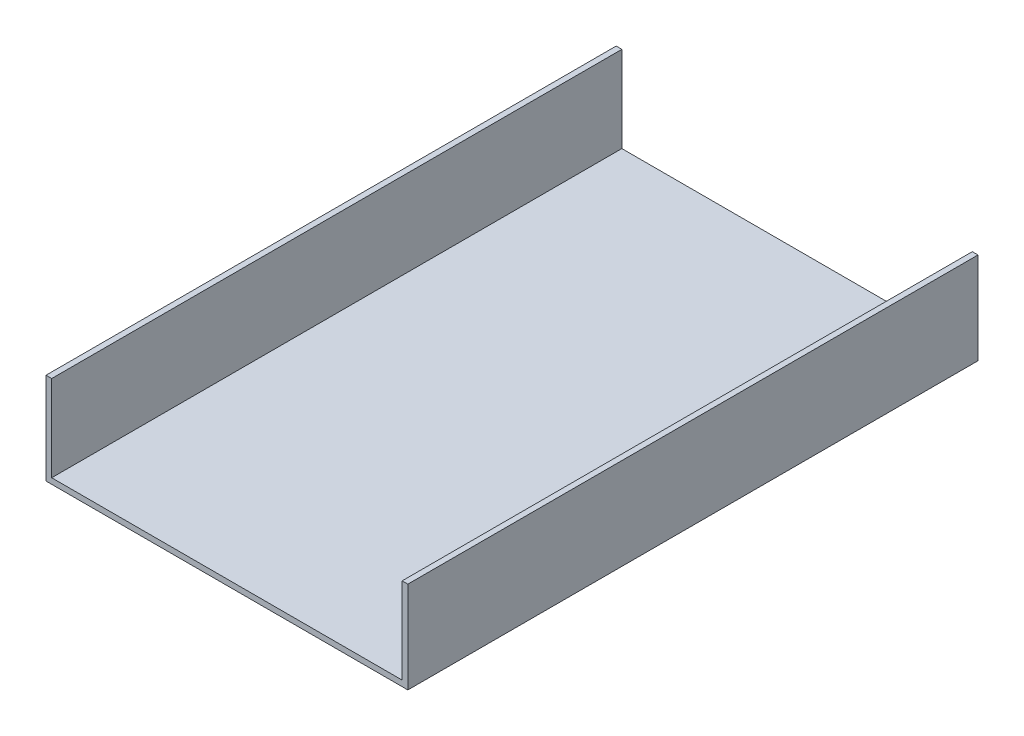
ISO-10303-21;
HEADER;
FILE_DESCRIPTION(('STEP AP214'),'2;1');
FILE_NAME('part.step','',(''),(''),'','','');
FILE_SCHEMA(('AUTOMOTIVE_DESIGN { 1 0 10303 214 1 1 1 1 }'));
ENDSEC;
DATA;
#1=APPLICATION_CONTEXT('core data for automotive mechanical design processes');
#2=APPLICATION_PROTOCOL_DEFINITION('international standard','automotive_design',2000,#1);
#3=PRODUCT_CONTEXT('',#1,'mechanical');
#4=PRODUCT('Part','Part','',(#3));
#5=PRODUCT_RELATED_PRODUCT_CATEGORY('part','',(#4));
#6=PRODUCT_DEFINITION_FORMATION('','',#4);
#7=PRODUCT_DEFINITION_CONTEXT('part definition',#1,'design');
#8=PRODUCT_DEFINITION('design','',#6,#7);
#9=PRODUCT_DEFINITION_SHAPE('','',#8);
#10=(LENGTH_UNIT() NAMED_UNIT(*) SI_UNIT(.MILLI.,.METRE.));
#11=(NAMED_UNIT(*) PLANE_ANGLE_UNIT() SI_UNIT($,.RADIAN.));
#12=(NAMED_UNIT(*) SI_UNIT($,.STERADIAN.) SOLID_ANGLE_UNIT());
#13=UNCERTAINTY_MEASURE_WITH_UNIT(LENGTH_MEASURE(1.E-05),#10,'distance_accuracy_value','');
#14=(GEOMETRIC_REPRESENTATION_CONTEXT(3) GLOBAL_UNCERTAINTY_ASSIGNED_CONTEXT((#13)) GLOBAL_UNIT_ASSIGNED_CONTEXT((#10,
#11,#12)) REPRESENTATION_CONTEXT('',''));
#15=CARTESIAN_POINT('',(0.,0.,0.));
#16=DIRECTION('',(0.,0.,1.));
#17=DIRECTION('',(1.,0.,0.));
#18=AXIS2_PLACEMENT_3D('',#15,#16,#17);
#19=CARTESIAN_POINT('',(-50.77,12.86,80.));
#20=DIRECTION('',(0.,-1.,0.));
#21=DIRECTION('',(0.,0.,-1.));
#22=AXIS2_PLACEMENT_3D('',#19,#20,#21);
#23=PLANE('',#22);
#24=DIRECTION('',(-1.,0.,0.));
#25=VECTOR('',#24,1.);
#26=CARTESIAN_POINT('',(-50.77,12.86,80.));
#27=LINE('',#26,#25);
#28=CARTESIAN_POINT('',(-49.17,12.86,80.));
#29=VERTEX_POINT('',#28);
#30=CARTESIAN_POINT('',(-50.77,12.86,80.));
#31=VERTEX_POINT('',#30);
#32=EDGE_CURVE('E52',#29,#31,#27,.T.);
#33=ORIENTED_EDGE('',*,*,#32,.F.);
#34=DIRECTION('',(0.,0.,1.));
#35=VECTOR('',#34,1.);
#36=CARTESIAN_POINT('',(-49.17,12.86,-80.));
#37=LINE('',#36,#35);
#38=CARTESIAN_POINT('',(-49.17,12.86,-80.));
#39=VERTEX_POINT('',#38);
#40=EDGE_CURVE('E119',#39,#29,#37,.T.);
#41=ORIENTED_EDGE('',*,*,#40,.F.);
#42=DIRECTION('',(-1.,0.,0.));
#43=VECTOR('',#42,1.);
#44=CARTESIAN_POINT('',(-50.77,12.86,-80.));
#45=LINE('',#44,#43);
#46=CARTESIAN_POINT('',(-50.77,12.86,-80.));
#47=VERTEX_POINT('',#46);
#48=EDGE_CURVE('E78',#39,#47,#45,.T.);
#49=ORIENTED_EDGE('',*,*,#48,.T.);
#50=DIRECTION('',(0.,0.,-1.));
#51=VECTOR('',#50,1.);
#52=CARTESIAN_POINT('',(-50.77,12.86,80.));
#53=LINE('',#52,#51);
#54=EDGE_CURVE('E124',#31,#47,#53,.T.);
#55=ORIENTED_EDGE('',*,*,#54,.F.);
#56=EDGE_LOOP('',(#33,#41,#49,#55));
#57=FACE_BOUND('',#56,.T.);
#58=ADVANCED_FACE('F35',(#57),#23,.F.);
#59=CARTESIAN_POINT('',(0.,0.,80.));
#60=DIRECTION('',(0.,0.,1.));
#61=DIRECTION('',(1.,0.,0.));
#62=AXIS2_PLACEMENT_3D('',#59,#60,#61);
#63=PLANE('',#62);
#64=DIRECTION('',(0.,-1.,0.));
#65=VECTOR('',#64,1.);
#66=CARTESIAN_POINT('',(-49.17,11.26,80.));
#67=LINE('',#66,#65);
#68=CARTESIAN_POINT('',(-49.17,-11.26,80.));
#69=VERTEX_POINT('',#68);
#70=EDGE_CURVE('E109',#29,#69,#67,.T.);
#71=ORIENTED_EDGE('',*,*,#70,.F.);
#72=ORIENTED_EDGE('',*,*,#32,.T.);
#73=DIRECTION('',(0.,-1.,0.));
#74=VECTOR('',#73,1.);
#75=CARTESIAN_POINT('',(-50.77,12.86,80.));
#76=LINE('',#75,#74);
#77=CARTESIAN_POINT('',(-50.77,-12.86,80.));
#78=VERTEX_POINT('',#77);
#79=EDGE_CURVE('E143',#31,#78,#76,.T.);
#80=ORIENTED_EDGE('',*,*,#79,.T.);
#81=DIRECTION('',(1.,0.,0.));
#82=VECTOR('',#81,1.);
#83=CARTESIAN_POINT('',(-50.77,-12.86,80.));
#84=LINE('',#83,#82);
#85=CARTESIAN_POINT('',(50.77,-12.86,80.));
#86=VERTEX_POINT('',#85);
#87=EDGE_CURVE('E85',#78,#86,#84,.T.);
#88=ORIENTED_EDGE('',*,*,#87,.T.);
#89=DIRECTION('',(0.,1.,0.));
#90=VECTOR('',#89,1.);
#91=CARTESIAN_POINT('',(50.77,12.86,80.));
#92=LINE('',#91,#90);
#93=CARTESIAN_POINT('',(50.77,12.86,80.));
#94=VERTEX_POINT('',#93);
#95=EDGE_CURVE('E127',#86,#94,#92,.T.);
#96=ORIENTED_EDGE('',*,*,#95,.T.);
#97=CARTESIAN_POINT('',(49.17,12.86,80.));
#98=VERTEX_POINT('',#97);
#99=EDGE_CURVE('E126',#94,#98,#27,.T.);
#100=ORIENTED_EDGE('',*,*,#99,.T.);
#101=DIRECTION('',(0.,1.,0.));
#102=VECTOR('',#101,1.);
#103=CARTESIAN_POINT('',(49.17,11.26,80.));
#104=LINE('',#103,#102);
#105=CARTESIAN_POINT('',(49.17,-11.26,80.));
#106=VERTEX_POINT('',#105);
#107=EDGE_CURVE('E159',#106,#98,#104,.T.);
#108=ORIENTED_EDGE('',*,*,#107,.F.);
#109=DIRECTION('',(1.,0.,0.));
#110=VECTOR('',#109,1.);
#111=CARTESIAN_POINT('',(-49.17,-11.26,80.));
#112=LINE('',#111,#110);
#113=EDGE_CURVE('E113',#69,#106,#112,.T.);
#114=ORIENTED_EDGE('',*,*,#113,.F.);
#115=EDGE_LOOP('',(#71,#72,#80,#88,#96,#100,#108,#114));
#116=FACE_BOUND('',#115,.T.);
#117=ADVANCED_FACE('F111',(#116),#63,.T.);
#118=CARTESIAN_POINT('',(0.,0.,-80.));
#119=DIRECTION('',(0.,0.,1.));
#120=DIRECTION('',(1.,0.,0.));
#121=AXIS2_PLACEMENT_3D('',#118,#119,#120);
#122=PLANE('',#121);
#123=ORIENTED_EDGE('',*,*,#48,.F.);
#124=DIRECTION('',(0.,-1.,0.));
#125=VECTOR('',#124,1.);
#126=CARTESIAN_POINT('',(-49.17,11.26,-80.));
#127=LINE('',#126,#125);
#128=CARTESIAN_POINT('',(-49.17,-11.26,-80.));
#129=VERTEX_POINT('',#128);
#130=EDGE_CURVE('E121',#39,#129,#127,.T.);
#131=ORIENTED_EDGE('',*,*,#130,.T.);
#132=DIRECTION('',(1.,0.,0.));
#133=VECTOR('',#132,1.);
#134=CARTESIAN_POINT('',(-49.17,-11.26,-80.));
#135=LINE('',#134,#133);
#136=CARTESIAN_POINT('',(49.17,-11.26,-80.));
#137=VERTEX_POINT('',#136);
#138=EDGE_CURVE('E167',#129,#137,#135,.T.);
#139=ORIENTED_EDGE('',*,*,#138,.T.);
#140=DIRECTION('',(0.,1.,0.));
#141=VECTOR('',#140,1.);
#142=CARTESIAN_POINT('',(49.17,11.26,-80.));
#143=LINE('',#142,#141);
#144=CARTESIAN_POINT('',(49.17,12.86,-80.));
#145=VERTEX_POINT('',#144);
#146=EDGE_CURVE('E117',#137,#145,#143,.T.);
#147=ORIENTED_EDGE('',*,*,#146,.T.);
#148=CARTESIAN_POINT('',(50.77,12.86,-80.));
#149=VERTEX_POINT('',#148);
#150=EDGE_CURVE('E140',#149,#145,#45,.T.);
#151=ORIENTED_EDGE('',*,*,#150,.F.);
#152=DIRECTION('',(0.,1.,0.));
#153=VECTOR('',#152,1.);
#154=CARTESIAN_POINT('',(50.77,12.86,-80.));
#155=LINE('',#154,#153);
#156=CARTESIAN_POINT('',(50.77,-12.86,-80.));
#157=VERTEX_POINT('',#156);
#158=EDGE_CURVE('E71',#157,#149,#155,.T.);
#159=ORIENTED_EDGE('',*,*,#158,.F.);
#160=DIRECTION('',(1.,0.,0.));
#161=VECTOR('',#160,1.);
#162=CARTESIAN_POINT('',(-50.77,-12.86,-80.));
#163=LINE('',#162,#161);
#164=CARTESIAN_POINT('',(-50.77,-12.86,-80.));
#165=VERTEX_POINT('',#164);
#166=EDGE_CURVE('E136',#165,#157,#163,.T.);
#167=ORIENTED_EDGE('',*,*,#166,.F.);
#168=DIRECTION('',(0.,-1.,0.));
#169=VECTOR('',#168,1.);
#170=CARTESIAN_POINT('',(-50.77,12.86,-80.));
#171=LINE('',#170,#169);
#172=EDGE_CURVE('E133',#47,#165,#171,.T.);
#173=ORIENTED_EDGE('',*,*,#172,.F.);
#174=EDGE_LOOP('',(#123,#131,#139,#147,#151,#159,#167,#173));
#175=FACE_BOUND('',#174,.T.);
#176=ADVANCED_FACE('F150',(#175),#122,.F.);
#177=CARTESIAN_POINT('',(-50.77,12.86,80.));
#178=DIRECTION('',(1.,0.,0.));
#179=DIRECTION('',(0.,0.,-1.));
#180=AXIS2_PLACEMENT_3D('',#177,#178,#179);
#181=PLANE('',#180);
#182=ORIENTED_EDGE('',*,*,#172,.T.);
#183=DIRECTION('',(0.,0.,-1.));
#184=VECTOR('',#183,1.);
#185=CARTESIAN_POINT('',(-50.77,-12.86,80.));
#186=LINE('',#185,#184);
#187=EDGE_CURVE('E11',#78,#165,#186,.T.);
#188=ORIENTED_EDGE('',*,*,#187,.F.);
#189=ORIENTED_EDGE('',*,*,#79,.F.);
#190=ORIENTED_EDGE('',*,*,#54,.T.);
#191=EDGE_LOOP('',(#182,#188,#189,#190));
#192=FACE_BOUND('',#191,.T.);
#193=ADVANCED_FACE('F37',(#192),#181,.F.);
#194=CARTESIAN_POINT('',(-50.77,-12.86,80.));
#195=DIRECTION('',(0.,1.,0.));
#196=DIRECTION('',(0.,0.,1.));
#197=AXIS2_PLACEMENT_3D('',#194,#195,#196);
#198=PLANE('',#197);
#199=ORIENTED_EDGE('',*,*,#166,.T.);
#200=DIRECTION('',(0.,0.,-1.));
#201=VECTOR('',#200,1.);
#202=CARTESIAN_POINT('',(50.77,-12.86,80.));
#203=LINE('',#202,#201);
#204=EDGE_CURVE('E44',#86,#157,#203,.T.);
#205=ORIENTED_EDGE('',*,*,#204,.F.);
#206=ORIENTED_EDGE('',*,*,#87,.F.);
#207=ORIENTED_EDGE('',*,*,#187,.T.);
#208=EDGE_LOOP('',(#199,#205,#206,#207));
#209=FACE_BOUND('',#208,.T.);
#210=ADVANCED_FACE('F179',(#209),#198,.F.);
#211=CARTESIAN_POINT('',(50.77,12.86,80.));
#212=DIRECTION('',(-1.,0.,0.));
#213=DIRECTION('',(0.,0.,1.));
#214=AXIS2_PLACEMENT_3D('',#211,#212,#213);
#215=PLANE('',#214);
#216=ORIENTED_EDGE('',*,*,#158,.T.);
#217=DIRECTION('',(0.,0.,-1.));
#218=VECTOR('',#217,1.);
#219=CARTESIAN_POINT('',(50.77,12.86,80.));
#220=LINE('',#219,#218);
#221=EDGE_CURVE('E145',#94,#149,#220,.T.);
#222=ORIENTED_EDGE('',*,*,#221,.F.);
#223=ORIENTED_EDGE('',*,*,#95,.F.);
#224=ORIENTED_EDGE('',*,*,#204,.T.);
#225=EDGE_LOOP('',(#216,#222,#223,#224));
#226=FACE_BOUND('',#225,.T.);
#227=ADVANCED_FACE('F147',(#226),#215,.F.);
#228=ORIENTED_EDGE('',*,*,#150,.T.);
#229=DIRECTION('',(0.,0.,-1.));
#230=VECTOR('',#229,1.);
#231=CARTESIAN_POINT('',(49.17,12.86,-80.));
#232=LINE('',#231,#230);
#233=EDGE_CURVE('E122',#98,#145,#232,.T.);
#234=ORIENTED_EDGE('',*,*,#233,.F.);
#235=ORIENTED_EDGE('',*,*,#99,.F.);
#236=ORIENTED_EDGE('',*,*,#221,.T.);
#237=EDGE_LOOP('',(#228,#234,#235,#236));
#238=FACE_BOUND('',#237,.T.);
#239=ADVANCED_FACE('F157',(#238),#23,.F.);
#240=CARTESIAN_POINT('',(-49.17,11.26,80.));
#241=DIRECTION('',(1.,0.,0.));
#242=DIRECTION('',(0.,0.,-1.));
#243=AXIS2_PLACEMENT_3D('',#240,#241,#242);
#244=PLANE('',#243);
#245=ORIENTED_EDGE('',*,*,#70,.T.);
#246=DIRECTION('',(0.,0.,-1.));
#247=VECTOR('',#246,1.);
#248=CARTESIAN_POINT('',(-49.17,-11.26,80.));
#249=LINE('',#248,#247);
#250=EDGE_CURVE('E137',#69,#129,#249,.T.);
#251=ORIENTED_EDGE('',*,*,#250,.T.);
#252=ORIENTED_EDGE('',*,*,#130,.F.);
#253=ORIENTED_EDGE('',*,*,#40,.T.);
#254=EDGE_LOOP('',(#245,#251,#252,#253));
#255=FACE_BOUND('',#254,.T.);
#256=ADVANCED_FACE('F120',(#255),#244,.T.);
#257=CARTESIAN_POINT('',(-49.17,-11.26,80.));
#258=DIRECTION('',(0.,1.,0.));
#259=DIRECTION('',(0.,0.,1.));
#260=AXIS2_PLACEMENT_3D('',#257,#258,#259);
#261=PLANE('',#260);
#262=ORIENTED_EDGE('',*,*,#138,.F.);
#263=ORIENTED_EDGE('',*,*,#250,.F.);
#264=ORIENTED_EDGE('',*,*,#113,.T.);
#265=DIRECTION('',(0.,0.,-1.));
#266=VECTOR('',#265,1.);
#267=CARTESIAN_POINT('',(49.17,-11.26,80.));
#268=LINE('',#267,#266);
#269=EDGE_CURVE('E164',#106,#137,#268,.T.);
#270=ORIENTED_EDGE('',*,*,#269,.T.);
#271=EDGE_LOOP('',(#262,#263,#264,#270));
#272=FACE_BOUND('',#271,.T.);
#273=ADVANCED_FACE('F177',(#272),#261,.T.);
#274=CARTESIAN_POINT('',(49.17,11.26,80.));
#275=DIRECTION('',(-1.,0.,0.));
#276=DIRECTION('',(0.,0.,1.));
#277=AXIS2_PLACEMENT_3D('',#274,#275,#276);
#278=PLANE('',#277);
#279=ORIENTED_EDGE('',*,*,#233,.T.);
#280=ORIENTED_EDGE('',*,*,#146,.F.);
#281=ORIENTED_EDGE('',*,*,#269,.F.);
#282=ORIENTED_EDGE('',*,*,#107,.T.);
#283=EDGE_LOOP('',(#279,#280,#281,#282));
#284=FACE_BOUND('',#283,.T.);
#285=ADVANCED_FACE('F173',(#284),#278,.T.);
#286=CLOSED_SHELL('',(#58,#117,#176,#193,#210,#227,#239,#256,#273,#285));
#287=MANIFOLD_SOLID_BREP('B2',#286);
#288=ADVANCED_BREP_SHAPE_REPRESENTATION('',(#18,#287),#14);
#289=SHAPE_DEFINITION_REPRESENTATION(#9,#288);
ENDSEC;
END-ISO-10303-21;
